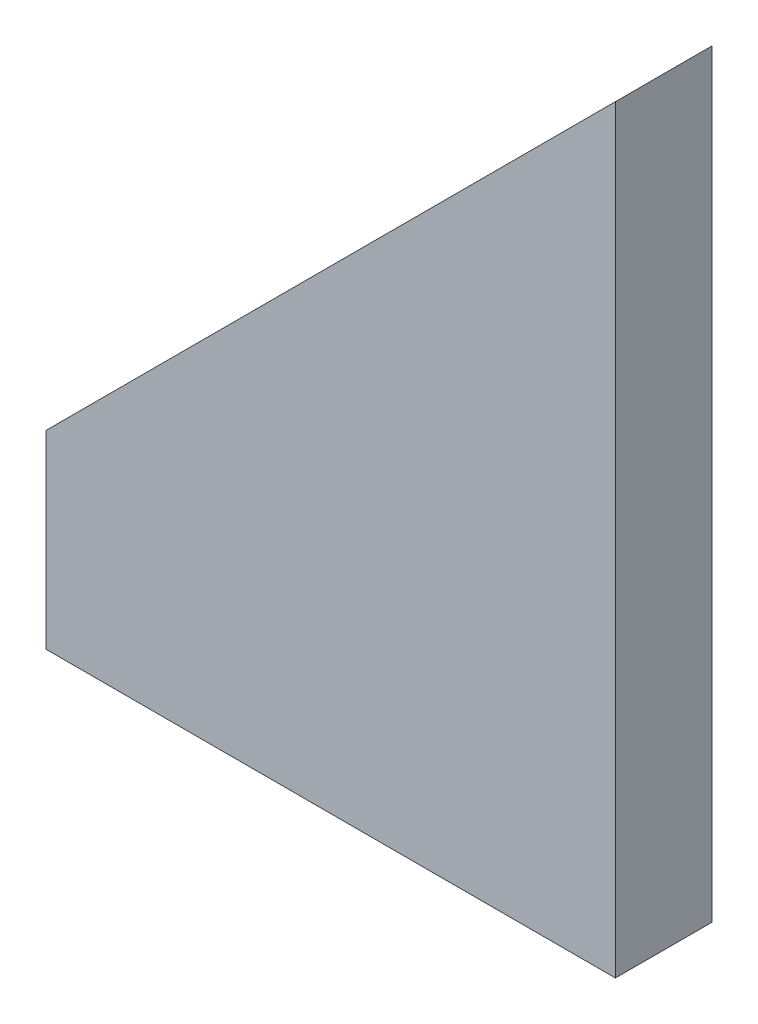
ISO-10303-21;
HEADER;
FILE_DESCRIPTION(('STEP AP214'),'2;1');
FILE_NAME('part.step','',(''),(''),'','','');
FILE_SCHEMA(('AUTOMOTIVE_DESIGN { 1 0 10303 214 1 1 1 1 }'));
ENDSEC;
DATA;
#1=APPLICATION_CONTEXT('core data for automotive mechanical design processes');
#2=APPLICATION_PROTOCOL_DEFINITION('international standard','automotive_design',2000,#1);
#3=PRODUCT_CONTEXT('',#1,'mechanical');
#4=PRODUCT('Part','Part','',(#3));
#5=PRODUCT_RELATED_PRODUCT_CATEGORY('part','',(#4));
#6=PRODUCT_DEFINITION_FORMATION('','',#4);
#7=PRODUCT_DEFINITION_CONTEXT('part definition',#1,'design');
#8=PRODUCT_DEFINITION('design','',#6,#7);
#9=PRODUCT_DEFINITION_SHAPE('','',#8);
#10=(LENGTH_UNIT() NAMED_UNIT(*) SI_UNIT(.MILLI.,.METRE.));
#11=(NAMED_UNIT(*) PLANE_ANGLE_UNIT() SI_UNIT($,.RADIAN.));
#12=(NAMED_UNIT(*) SI_UNIT($,.STERADIAN.) SOLID_ANGLE_UNIT());
#13=UNCERTAINTY_MEASURE_WITH_UNIT(LENGTH_MEASURE(1.E-05),#10,'distance_accuracy_value','');
#14=(GEOMETRIC_REPRESENTATION_CONTEXT(3) GLOBAL_UNCERTAINTY_ASSIGNED_CONTEXT((#13)) GLOBAL_UNIT_ASSIGNED_CONTEXT((#10,
#11,#12)) REPRESENTATION_CONTEXT('',''));
#15=CARTESIAN_POINT('',(0.,0.,0.));
#16=DIRECTION('',(0.,0.,1.));
#17=DIRECTION('',(1.,0.,0.));
#18=AXIS2_PLACEMENT_3D('',#15,#16,#17);
#19=CARTESIAN_POINT('',(-75.,-75.0000000000008,6.35));
#20=DIRECTION('',(0.707106781186551,-0.707106781186543,0.));
#21=DIRECTION('',(0.707106781186544,0.707106781186551,0.));
#22=AXIS2_PLACEMENT_3D('',#19,#20,#21);
#23=PLANE('',#22);
#24=DIRECTION('',(-0.707106781186544,-0.707106781186551,0.));
#25=VECTOR('',#24,1.);
#26=CARTESIAN_POINT('',(-75.,-75.0000000000008,-6.35));
#27=LINE('',#26,#25);
#28=CARTESIAN_POINT('',(0.,0.,-6.35));
#29=VERTEX_POINT('',#28);
#30=CARTESIAN_POINT('',(-75.,-75.0000000000008,-6.35));
#31=VERTEX_POINT('',#30);
#32=EDGE_CURVE('E96',#29,#31,#27,.T.);
#33=ORIENTED_EDGE('',*,*,#32,.T.);
#34=DIRECTION('',(0.,0.,-1.));
#35=VECTOR('',#34,1.);
#36=CARTESIAN_POINT('',(-75.,-75.0000000000008,6.35));
#37=LINE('',#36,#35);
#38=CARTESIAN_POINT('',(-75.,-75.0000000000008,6.35));
#39=VERTEX_POINT('',#38);
#40=EDGE_CURVE('E11',#39,#31,#37,.T.);
#41=ORIENTED_EDGE('',*,*,#40,.F.);
#42=DIRECTION('',(-0.707106781186544,-0.707106781186551,0.));
#43=VECTOR('',#42,1.);
#44=CARTESIAN_POINT('',(-75.,-75.0000000000008,6.35));
#45=LINE('',#44,#43);
#46=CARTESIAN_POINT('',(0.,0.,6.35));
#47=VERTEX_POINT('',#46);
#48=EDGE_CURVE('E84',#47,#39,#45,.T.);
#49=ORIENTED_EDGE('',*,*,#48,.F.);
#50=DIRECTION('',(0.,0.,-1.));
#51=VECTOR('',#50,1.);
#52=CARTESIAN_POINT('',(0.,0.,6.35));
#53=LINE('',#52,#51);
#54=EDGE_CURVE('E92',#47,#29,#53,.T.);
#55=ORIENTED_EDGE('',*,*,#54,.T.);
#56=EDGE_LOOP('',(#33,#41,#49,#55));
#57=FACE_BOUND('',#56,.T.);
#58=ADVANCED_FACE('F33',(#57),#23,.F.);
#59=CARTESIAN_POINT('',(-75.,-75.0000000000008,6.35));
#60=DIRECTION('',(1.,0.,0.));
#61=DIRECTION('',(0.,0.,-1.));
#62=AXIS2_PLACEMENT_3D('',#59,#60,#61);
#63=PLANE('',#62);
#64=DIRECTION('',(0.,-1.,0.));
#65=VECTOR('',#64,1.);
#66=CARTESIAN_POINT('',(-75.,-75.0000000000008,-6.35));
#67=LINE('',#66,#65);
#68=CARTESIAN_POINT('',(-75.,-100.,-6.35));
#69=VERTEX_POINT('',#68);
#70=EDGE_CURVE('E88',#31,#69,#67,.T.);
#71=ORIENTED_EDGE('',*,*,#70,.T.);
#72=DIRECTION('',(0.,0.,-1.));
#73=VECTOR('',#72,1.);
#74=CARTESIAN_POINT('',(-75.,-100.,6.35));
#75=LINE('',#74,#73);
#76=CARTESIAN_POINT('',(-75.,-100.,6.35));
#77=VERTEX_POINT('',#76);
#78=EDGE_CURVE('E41',#77,#69,#75,.T.);
#79=ORIENTED_EDGE('',*,*,#78,.F.);
#80=DIRECTION('',(0.,-1.,0.));
#81=VECTOR('',#80,1.);
#82=CARTESIAN_POINT('',(-75.,-75.0000000000008,6.35));
#83=LINE('',#82,#81);
#84=EDGE_CURVE('E79',#39,#77,#83,.T.);
#85=ORIENTED_EDGE('',*,*,#84,.F.);
#86=ORIENTED_EDGE('',*,*,#40,.T.);
#87=EDGE_LOOP('',(#71,#79,#85,#86));
#88=FACE_BOUND('',#87,.T.);
#89=ADVANCED_FACE('F87',(#88),#63,.F.);
#90=CARTESIAN_POINT('',(0.,-100.,6.35));
#91=DIRECTION('',(0.,1.,0.));
#92=DIRECTION('',(-1.,0.,0.));
#93=AXIS2_PLACEMENT_3D('',#90,#91,#92);
#94=PLANE('',#93);
#95=DIRECTION('',(1.,0.,0.));
#96=VECTOR('',#95,1.);
#97=CARTESIAN_POINT('',(0.,-100.,-6.35));
#98=LINE('',#97,#96);
#99=CARTESIAN_POINT('',(0.,-100.,-6.35));
#100=VERTEX_POINT('',#99);
#101=EDGE_CURVE('E66',#69,#100,#98,.T.);
#102=ORIENTED_EDGE('',*,*,#101,.T.);
#103=DIRECTION('',(0.,0.,-1.));
#104=VECTOR('',#103,1.);
#105=CARTESIAN_POINT('',(0.,-100.,6.35));
#106=LINE('',#105,#104);
#107=CARTESIAN_POINT('',(0.,-100.,6.35));
#108=VERTEX_POINT('',#107);
#109=EDGE_CURVE('E89',#108,#100,#106,.T.);
#110=ORIENTED_EDGE('',*,*,#109,.F.);
#111=DIRECTION('',(1.,0.,0.));
#112=VECTOR('',#111,1.);
#113=CARTESIAN_POINT('',(0.,-100.,6.35));
#114=LINE('',#113,#112);
#115=EDGE_CURVE('E82',#77,#108,#114,.T.);
#116=ORIENTED_EDGE('',*,*,#115,.F.);
#117=ORIENTED_EDGE('',*,*,#78,.T.);
#118=EDGE_LOOP('',(#102,#110,#116,#117));
#119=FACE_BOUND('',#118,.T.);
#120=ADVANCED_FACE('F90',(#119),#94,.F.);
#121=CARTESIAN_POINT('',(0.,0.,6.35));
#122=DIRECTION('',(-1.,0.,0.));
#123=DIRECTION('',(0.,-1.,0.));
#124=AXIS2_PLACEMENT_3D('',#121,#122,#123);
#125=PLANE('',#124);
#126=DIRECTION('',(0.,1.,0.));
#127=VECTOR('',#126,1.);
#128=CARTESIAN_POINT('',(0.,0.,-6.35));
#129=LINE('',#128,#127);
#130=EDGE_CURVE('E72',#100,#29,#129,.T.);
#131=ORIENTED_EDGE('',*,*,#130,.T.);
#132=ORIENTED_EDGE('',*,*,#54,.F.);
#133=DIRECTION('',(0.,1.,0.));
#134=VECTOR('',#133,1.);
#135=CARTESIAN_POINT('',(0.,0.,6.35));
#136=LINE('',#135,#134);
#137=EDGE_CURVE('E49',#108,#47,#136,.T.);
#138=ORIENTED_EDGE('',*,*,#137,.F.);
#139=ORIENTED_EDGE('',*,*,#109,.T.);
#140=EDGE_LOOP('',(#131,#132,#138,#139));
#141=FACE_BOUND('',#140,.T.);
#142=ADVANCED_FACE('F103',(#141),#125,.F.);
#143=CARTESIAN_POINT('',(0.,0.,6.35));
#144=DIRECTION('',(0.,0.,-1.));
#145=DIRECTION('',(-1.,0.,0.));
#146=AXIS2_PLACEMENT_3D('',#143,#144,#145);
#147=PLANE('',#146);
#148=ORIENTED_EDGE('',*,*,#48,.T.);
#149=ORIENTED_EDGE('',*,*,#84,.T.);
#150=ORIENTED_EDGE('',*,*,#115,.T.);
#151=ORIENTED_EDGE('',*,*,#137,.T.);
#152=EDGE_LOOP('',(#148,#149,#150,#151));
#153=FACE_BOUND('',#152,.T.);
#154=ADVANCED_FACE('F80',(#153),#147,.F.);
#155=CARTESIAN_POINT('',(0.,0.,-6.35));
#156=DIRECTION('',(0.,0.,-1.));
#157=DIRECTION('',(-1.,0.,0.));
#158=AXIS2_PLACEMENT_3D('',#155,#156,#157);
#159=PLANE('',#158);
#160=ORIENTED_EDGE('',*,*,#32,.F.);
#161=ORIENTED_EDGE('',*,*,#130,.F.);
#162=ORIENTED_EDGE('',*,*,#101,.F.);
#163=ORIENTED_EDGE('',*,*,#70,.F.);
#164=EDGE_LOOP('',(#160,#161,#162,#163));
#165=FACE_BOUND('',#164,.T.);
#166=ADVANCED_FACE('F106',(#165),#159,.T.);
#167=CLOSED_SHELL('',(#58,#89,#120,#142,#154,#166));
#168=MANIFOLD_SOLID_BREP('B2',#167);
#169=ADVANCED_BREP_SHAPE_REPRESENTATION('',(#18,#168),#14);
#170=SHAPE_DEFINITION_REPRESENTATION(#9,#169);
ENDSEC;
END-ISO-10303-21;
